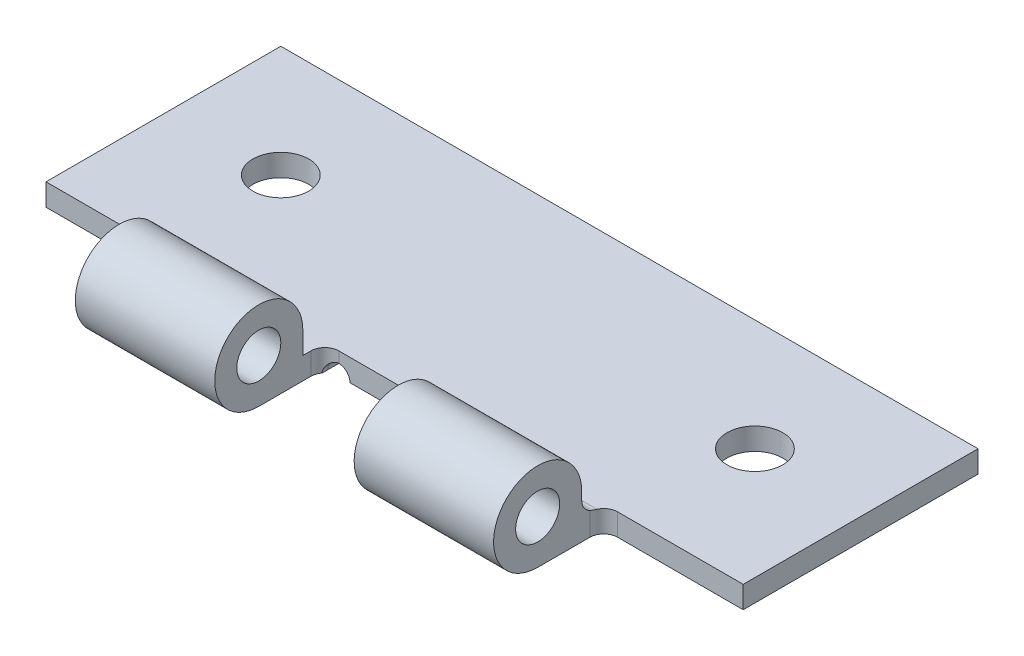
ISO-10303-21;
HEADER;
FILE_DESCRIPTION(('STEP AP214'),'2;1');
FILE_NAME('part.step','',(''),(''),'','','');
FILE_SCHEMA(('AUTOMOTIVE_DESIGN { 1 0 10303 214 1 1 1 1 }'));
ENDSEC;
DATA;
#1=APPLICATION_CONTEXT('core data for automotive mechanical design processes');
#2=APPLICATION_PROTOCOL_DEFINITION('international standard','automotive_design',2000,#1);
#3=PRODUCT_CONTEXT('',#1,'mechanical');
#4=PRODUCT('Part','Part','',(#3));
#5=PRODUCT_RELATED_PRODUCT_CATEGORY('part','',(#4));
#6=PRODUCT_DEFINITION_FORMATION('','',#4);
#7=PRODUCT_DEFINITION_CONTEXT('part definition',#1,'design');
#8=PRODUCT_DEFINITION('design','',#6,#7);
#9=PRODUCT_DEFINITION_SHAPE('','',#8);
#10=(LENGTH_UNIT() NAMED_UNIT(*) SI_UNIT(.MILLI.,.METRE.));
#11=(NAMED_UNIT(*) PLANE_ANGLE_UNIT() SI_UNIT($,.RADIAN.));
#12=(NAMED_UNIT(*) SI_UNIT($,.STERADIAN.) SOLID_ANGLE_UNIT());
#13=UNCERTAINTY_MEASURE_WITH_UNIT(LENGTH_MEASURE(1.E-05),#10,'distance_accuracy_value','');
#14=(GEOMETRIC_REPRESENTATION_CONTEXT(3) GLOBAL_UNCERTAINTY_ASSIGNED_CONTEXT((#13)) GLOBAL_UNIT_ASSIGNED_CONTEXT((#10,
#11,#12)) REPRESENTATION_CONTEXT('',''));
#15=CARTESIAN_POINT('',(0.,0.,0.));
#16=DIRECTION('',(0.,0.,1.));
#17=DIRECTION('',(1.,0.,0.));
#18=AXIS2_PLACEMENT_3D('',#15,#16,#17);
#19=CARTESIAN_POINT('',(0.,0.,0.));
#20=DIRECTION('',(0.,-1.,0.));
#21=DIRECTION('',(0.,0.,-1.));
#22=AXIS2_PLACEMENT_3D('',#19,#20,#21);
#23=PLANE('',#22);
#24=CARTESIAN_POINT('',(13.2676056338028,0.,-1.25352112676056));
#25=DIRECTION('',(0.,-1.,0.));
#26=DIRECTION('',(0.,0.,-1.));
#27=AXIS2_PLACEMENT_3D('',#24,#25,#26);
#28=CIRCLE('',#27,1.);
#29=CARTESIAN_POINT('',(13.2676056338028,0.,-2.25352112676057));
#30=VERTEX_POINT('',#29);
#31=EDGE_CURVE('E302',#30,#30,#28,.T.);
#32=ORIENTED_EDGE('',*,*,#31,.F.);
#33=EDGE_LOOP('',(#32));
#34=FACE_BOUND('',#33,.T.);
#35=DIRECTION('',(1.,0.,0.));
#36=VECTOR('',#35,1.);
#37=CARTESIAN_POINT('',(2.26760563380282,0.,3.16647887323944));
#38=LINE('',#37,#36);
#39=CARTESIAN_POINT('',(3.16760563380282,0.,3.16647887323944));
#40=VERTEX_POINT('',#39);
#41=CARTESIAN_POINT('',(6.76760563380282,0.,3.16647887323944));
#42=VERTEX_POINT('',#41);
#43=EDGE_CURVE('E231',#40,#42,#38,.T.);
#44=ORIENTED_EDGE('',*,*,#43,.F.);
#45=DIRECTION('',(0.,0.,1.));
#46=VECTOR('',#45,1.);
#47=CARTESIAN_POINT('',(3.16760563380282,0.,-6.25352112676056));
#48=LINE('',#47,#46);
#49=CARTESIAN_POINT('',(3.16760563380282,0.,-5.25352112676056));
#50=VERTEX_POINT('',#49);
#51=EDGE_CURVE('E211',#40,#50,#48,.F.);
#52=ORIENTED_EDGE('',*,*,#51,.T.);
#53=DIRECTION('',(-1.,0.,0.));
#54=VECTOR('',#53,1.);
#55=CARTESIAN_POINT('',(-7.73239436619718,0.,-5.25352112676056));
#56=LINE('',#55,#54);
#57=CARTESIAN_POINT('',(17.2676056338028,0.,-5.25352112676056));
#58=VERTEX_POINT('',#57);
#59=EDGE_CURVE('E346',#58,#50,#56,.T.);
#60=ORIENTED_EDGE('',*,*,#59,.F.);
#61=DIRECTION('',(0.,0.,-1.));
#62=VECTOR('',#61,1.);
#63=CARTESIAN_POINT('',(17.2676056338028,0.,4.74647887323944));
#64=LINE('',#63,#62);
#65=CARTESIAN_POINT('',(17.2676056338028,0.,3.16647887323944));
#66=VERTEX_POINT('',#65);
#67=EDGE_CURVE('E356',#66,#58,#64,.T.);
#68=ORIENTED_EDGE('',*,*,#67,.F.);
#69=DIRECTION('',(1.,0.,0.));
#70=VECTOR('',#69,1.);
#71=CARTESIAN_POINT('',(17.2676056338028,0.,3.16647887323944));
#72=LINE('',#71,#70);
#73=CARTESIAN_POINT('',(12.7676056338028,0.,3.16647887323944));
#74=VERTEX_POINT('',#73);
#75=EDGE_CURVE('E227',#74,#66,#72,.T.);
#76=ORIENTED_EDGE('',*,*,#75,.F.);
#77=CARTESIAN_POINT('',(12.7676056338028,0.,3.66647887323944));
#78=DIRECTION('',(0.,-1.,0.));
#79=DIRECTION('',(0.,0.,-1.));
#80=AXIS2_PLACEMENT_3D('',#77,#78,#79);
#81=CIRCLE('',#80,0.5);
#82=CARTESIAN_POINT('',(12.2676056338028,0.,3.66647887323944));
#83=VERTEX_POINT('',#82);
#84=EDGE_CURVE('E421',#74,#83,#81,.F.);
#85=ORIENTED_EDGE('',*,*,#84,.T.);
#86=DIRECTION('',(0.,0.,-1.));
#87=VECTOR('',#86,1.);
#88=CARTESIAN_POINT('',(12.2676056338028,0.,5.53647887323944));
#89=LINE('',#88,#87);
#90=CARTESIAN_POINT('',(12.2676056338028,0.,5.53647887323944));
#91=VERTEX_POINT('',#90);
#92=EDGE_CURVE('E328',#91,#83,#89,.T.);
#93=ORIENTED_EDGE('',*,*,#92,.F.);
#94=DIRECTION('',(1.,0.,0.));
#95=VECTOR('',#94,1.);
#96=CARTESIAN_POINT('',(7.26760563380282,0.,5.53647887323944));
#97=LINE('',#96,#95);
#98=CARTESIAN_POINT('',(7.26760563380282,0.,5.53647887323944));
#99=VERTEX_POINT('',#98);
#100=EDGE_CURVE('E324',#99,#91,#97,.T.);
#101=ORIENTED_EDGE('',*,*,#100,.F.);
#102=DIRECTION('',(0.,0.,-1.));
#103=VECTOR('',#102,1.);
#104=CARTESIAN_POINT('',(7.26760563380282,0.,5.53647887323944));
#105=LINE('',#104,#103);
#106=CARTESIAN_POINT('',(7.26760563380282,0.,3.66647887323944));
#107=VERTEX_POINT('',#106);
#108=EDGE_CURVE('E316',#99,#107,#105,.T.);
#109=ORIENTED_EDGE('',*,*,#108,.T.);
#110=CARTESIAN_POINT('',(6.76760563380282,0.,3.66647887323944));
#111=DIRECTION('',(0.,-1.,0.));
#112=DIRECTION('',(0.,0.,-1.));
#113=AXIS2_PLACEMENT_3D('',#110,#111,#112);
#114=CIRCLE('',#113,0.5);
#115=EDGE_CURVE('E456',#107,#42,#114,.F.);
#116=ORIENTED_EDGE('',*,*,#115,.T.);
#117=EDGE_LOOP('',(#44,#52,#60,#68,#76,#85,#93,#101,#109,#116));
#118=FACE_BOUND('',#117,.T.);
#119=ADVANCED_FACE('F39',(#34,#118),#23,.T.);
#120=CARTESIAN_POINT('',(-3.73239436619718,0.,-1.25352112676056));
#121=DIRECTION('',(0.,-1.,0.));
#122=DIRECTION('',(0.,0.,-1.));
#123=AXIS2_PLACEMENT_3D('',#120,#121,#122);
#124=CIRCLE('',#123,1.);
#125=CARTESIAN_POINT('',(-3.73239436619718,0.,-2.25352112676057));
#126=VERTEX_POINT('',#125);
#127=EDGE_CURVE('E255',#126,#126,#124,.F.);
#128=ORIENTED_EDGE('',*,*,#127,.T.);
#129=EDGE_LOOP('',(#128));
#130=FACE_BOUND('',#129,.T.);
#131=CARTESIAN_POINT('',(2.36760563380282,0.,-5.25352112676056));
#132=VERTEX_POINT('',#131);
#133=CARTESIAN_POINT('',(-7.73239436619718,0.,-5.25352112676056));
#134=VERTEX_POINT('',#133);
#135=EDGE_CURVE('E209',#132,#134,#56,.T.);
#136=ORIENTED_EDGE('',*,*,#135,.F.);
#137=DIRECTION('',(0.,0.,1.));
#138=VECTOR('',#137,1.);
#139=CARTESIAN_POINT('',(2.36760563380282,0.,-6.25352112676056));
#140=LINE('',#139,#138);
#141=CARTESIAN_POINT('',(2.36760563380282,0.,3.16647887323944));
#142=VERTEX_POINT('',#141);
#143=EDGE_CURVE('E196',#132,#142,#140,.T.);
#144=ORIENTED_EDGE('',*,*,#143,.T.);
#145=DIRECTION('',(0.,0.,1.));
#146=VECTOR('',#145,1.);
#147=CARTESIAN_POINT('',(2.36760563380282,0.,3.16647887323944));
#148=LINE('',#147,#146);
#149=CARTESIAN_POINT('',(2.36760563380282,0.,3.36647887323944));
#150=VERTEX_POINT('',#149);
#151=EDGE_CURVE('E189',#142,#150,#148,.T.);
#152=ORIENTED_EDGE('',*,*,#151,.T.);
#153=CARTESIAN_POINT('',(2.76760563380282,0.,3.66647887323944));
#154=DIRECTION('',(0.,-1.,0.));
#155=DIRECTION('',(0.,0.,-1.));
#156=AXIS2_PLACEMENT_3D('',#153,#154,#155);
#157=CIRCLE('',#156,0.5);
#158=CARTESIAN_POINT('',(2.26760563380282,0.,3.66647887323944));
#159=VERTEX_POINT('',#158);
#160=EDGE_CURVE('E461',#150,#159,#157,.F.);
#161=ORIENTED_EDGE('',*,*,#160,.T.);
#162=DIRECTION('',(0.,0.,-1.));
#163=VECTOR('',#162,1.);
#164=CARTESIAN_POINT('',(2.26760563380282,0.,5.53647887323944));
#165=LINE('',#164,#163);
#166=CARTESIAN_POINT('',(2.26760563380282,0.,5.53647887323944));
#167=VERTEX_POINT('',#166);
#168=EDGE_CURVE('E273',#167,#159,#165,.T.);
#169=ORIENTED_EDGE('',*,*,#168,.F.);
#170=DIRECTION('',(-1.,0.,0.));
#171=VECTOR('',#170,1.);
#172=CARTESIAN_POINT('',(2.26760563380282,0.,5.53647887323944));
#173=LINE('',#172,#171);
#174=CARTESIAN_POINT('',(-2.73239436619718,0.,5.53647887323944));
#175=VERTEX_POINT('',#174);
#176=EDGE_CURVE('E287',#167,#175,#173,.T.);
#177=ORIENTED_EDGE('',*,*,#176,.T.);
#178=DIRECTION('',(0.,0.,-1.));
#179=VECTOR('',#178,1.);
#180=CARTESIAN_POINT('',(-2.73239436619718,0.,5.53647887323944));
#181=LINE('',#180,#179);
#182=CARTESIAN_POINT('',(-2.73239436619718,0.,3.66647887323944));
#183=VERTEX_POINT('',#182);
#184=EDGE_CURVE('E270',#175,#183,#181,.T.);
#185=ORIENTED_EDGE('',*,*,#184,.T.);
#186=CARTESIAN_POINT('',(-3.23239436619718,0.,3.66647887323944));
#187=DIRECTION('',(0.,-1.,0.));
#188=DIRECTION('',(0.,0.,-1.));
#189=AXIS2_PLACEMENT_3D('',#186,#187,#188);
#190=CIRCLE('',#189,0.5);
#191=CARTESIAN_POINT('',(-3.23239436619718,0.,3.16647887323944));
#192=VERTEX_POINT('',#191);
#193=EDGE_CURVE('E418',#183,#192,#190,.F.);
#194=ORIENTED_EDGE('',*,*,#193,.T.);
#195=DIRECTION('',(1.,0.,0.));
#196=VECTOR('',#195,1.);
#197=CARTESIAN_POINT('',(-7.73239436619718,0.,3.16647887323944));
#198=LINE('',#197,#196);
#199=CARTESIAN_POINT('',(-7.73239436619718,0.,3.16647887323944));
#200=VERTEX_POINT('',#199);
#201=EDGE_CURVE('E243',#200,#192,#198,.T.);
#202=ORIENTED_EDGE('',*,*,#201,.F.);
#203=DIRECTION('',(0.,0.,1.));
#204=VECTOR('',#203,1.);
#205=CARTESIAN_POINT('',(-7.73239436619718,0.,4.74647887323944));
#206=LINE('',#205,#204);
#207=EDGE_CURVE('E338',#134,#200,#206,.T.);
#208=ORIENTED_EDGE('',*,*,#207,.F.);
#209=EDGE_LOOP('',(#136,#144,#152,#161,#169,#177,#185,#194,#202,#208));
#210=FACE_BOUND('',#209,.T.);
#211=ADVANCED_FACE('F207',(#130,#210),#23,.T.);
#212=CARTESIAN_POINT('',(2.76760563380282,0.,3.66647887323944));
#213=DIRECTION('',(0.,-1.,0.));
#214=DIRECTION('',(0.,0.,-1.));
#215=AXIS2_PLACEMENT_3D('',#212,#213,#214);
#216=CYLINDRICAL_SURFACE('',#215,0.5);
#217=CARTESIAN_POINT('',(2.76760563380282,0.4,3.16647887323944));
#218=CARTESIAN_POINT('',(2.74827024317243,0.400029001810531,3.16644736894802));
#219=CARTESIAN_POINT('',(2.72897779877845,0.398600271028259,3.16759857671811));
#220=CARTESIAN_POINT('',(2.69116866166657,0.393081616588121,3.17200110549289));
#221=CARTESIAN_POINT('',(2.67264718159873,0.389012033724936,3.17523637293437));
#222=CARTESIAN_POINT('',(2.63680043914977,0.378471364605712,3.18353927358835));
#223=CARTESIAN_POINT('',(2.61947251181179,0.372005848685543,3.18860265589649));
#224=CARTESIAN_POINT('',(2.58625039872911,0.356991698998091,3.2001954513365));
#225=CARTESIAN_POINT('',(2.57035891424733,0.348439247977833,3.20672754918424));
#226=CARTESIAN_POINT('',(2.53496666622787,0.326273067599014,3.22332842010777));
#227=CARTESIAN_POINT('',(2.51612758214882,0.311932940005493,3.23383781260024));
#228=CARTESIAN_POINT('',(2.48151932609226,0.280540325168059,3.25589720802994));
#229=CARTESIAN_POINT('',(2.46575854914103,0.263480644910439,3.26744993436123));
#230=CARTESIAN_POINT('',(2.43717534101159,0.226647389361927,3.29076567896971));
#231=CARTESIAN_POINT('',(2.42440299333242,0.206835368717521,3.30252914823743));
#232=CARTESIAN_POINT('',(2.40231436611412,0.16469712736713,3.32471166120384));
#233=CARTESIAN_POINT('',(2.39298728172102,0.142379058140846,3.33513484004315));
#234=CARTESIAN_POINT('',(2.38131935735902,0.104859328617966,3.34894337015235));
#235=CARTESIAN_POINT('',(2.3776816741986,0.0904853845625058,3.35346293184157));
#236=CARTESIAN_POINT('',(2.37200477573013,0.0610097709844862,3.36066466891768));
#237=CARTESIAN_POINT('',(2.36995898885431,0.0459113693890692,3.36335439228086));
#238=CARTESIAN_POINT('',(2.36799721759471,0.0204818574887698,3.36595849040532));
#239=CARTESIAN_POINT('',(2.36759751443449,0.0102468798446438,3.36650052629709));
#240=CARTESIAN_POINT('',(2.36760563380282,0.,3.36647887323944));
#241=B_SPLINE_CURVE_WITH_KNOTS('',3,(#217,#218,#219,#220,#221,#222,#223,#224,#225,#226,#227,
#228,#229,#230,#231,#232,#233,#234,#235,#236,#237,#238,#239,#240),.UNSPECIFIED.,.F.,.F.,(4,2,2,
2,2,2,2,2,2,2,2,4),(0.,0.0578512233200793,0.11526206134538,0.172540253119604,0.229924009376504,
0.307224735322282,0.384733415851265,0.463460486012968,0.541938516974931,0.588284272735176,
0.634437676581463,0.665140421962059),.UNSPECIFIED.);
#242=CARTESIAN_POINT('',(2.76760563380282,0.4,3.16647887323944));
#243=VERTEX_POINT('',#242);
#244=EDGE_CURVE('E11',#243,#150,#241,.T.);
#245=ORIENTED_EDGE('',*,*,#244,.F.);
#246=DIRECTION('',(0.,-1.,0.));
#247=VECTOR('',#246,1.);
#248=CARTESIAN_POINT('',(2.76760563380282,0.,3.16647887323944));
#249=LINE('',#248,#247);
#250=CARTESIAN_POINT('',(2.76760563380282,0.79,3.16647887323944));
#251=VERTEX_POINT('',#250);
#252=EDGE_CURVE('E401',#251,#243,#249,.T.);
#253=ORIENTED_EDGE('',*,*,#252,.F.);
#254=CARTESIAN_POINT('',(2.76760563380282,0.79,3.66647887323944));
#255=DIRECTION('',(0.,-1.,0.));
#256=DIRECTION('',(0.,0.,-1.));
#257=AXIS2_PLACEMENT_3D('',#254,#255,#256);
#258=CIRCLE('',#257,0.5);
#259=CARTESIAN_POINT('',(2.26760563380282,0.79,3.66647887323944));
#260=VERTEX_POINT('',#259);
#261=EDGE_CURVE('E54',#260,#251,#258,.T.);
#262=ORIENTED_EDGE('',*,*,#261,.F.);
#263=DIRECTION('',(0.,-1.,0.));
#264=VECTOR('',#263,1.);
#265=CARTESIAN_POINT('',(2.26760563380282,1.58,3.66647887323944));
#266=LINE('',#265,#264);
#267=EDGE_CURVE('E412',#159,#260,#266,.F.);
#268=ORIENTED_EDGE('',*,*,#267,.F.);
#269=ORIENTED_EDGE('',*,*,#160,.F.);
#270=EDGE_LOOP('',(#245,#253,#262,#268,#269));
#271=FACE_BOUND('',#270,.T.);
#272=ADVANCED_FACE('F41',(#271),#216,.F.);
#273=CARTESIAN_POINT('',(-7.73239436619718,0.79,4.74647887323944));
#274=DIRECTION('',(1.,0.,0.));
#275=DIRECTION('',(0.,0.,-1.));
#276=AXIS2_PLACEMENT_3D('',#273,#274,#275);
#277=PLANE('',#276);
#278=DIRECTION('',(0.,-1.,0.));
#279=VECTOR('',#278,1.);
#280=CARTESIAN_POINT('',(-7.73239436619718,0.79,3.16647887323944));
#281=LINE('',#280,#279);
#282=CARTESIAN_POINT('',(-7.73239436619718,0.79,3.16647887323944));
#283=VERTEX_POINT('',#282);
#284=EDGE_CURVE('E215',#283,#200,#281,.T.);
#285=ORIENTED_EDGE('',*,*,#284,.F.);
#286=DIRECTION('',(0.,0.,1.));
#287=VECTOR('',#286,1.);
#288=CARTESIAN_POINT('',(-7.73239436619718,0.79,4.74647887323944));
#289=LINE('',#288,#287);
#290=CARTESIAN_POINT('',(-7.73239436619718,0.79,-5.25352112676056));
#291=VERTEX_POINT('',#290);
#292=EDGE_CURVE('E341',#291,#283,#289,.T.);
#293=ORIENTED_EDGE('',*,*,#292,.F.);
#294=DIRECTION('',(0.,-1.,0.));
#295=VECTOR('',#294,1.);
#296=CARTESIAN_POINT('',(-7.73239436619718,0.79,-5.25352112676056));
#297=LINE('',#296,#295);
#298=EDGE_CURVE('E352',#291,#134,#297,.T.);
#299=ORIENTED_EDGE('',*,*,#298,.T.);
#300=ORIENTED_EDGE('',*,*,#207,.T.);
#301=EDGE_LOOP('',(#285,#293,#299,#300));
#302=FACE_BOUND('',#301,.T.);
#303=ADVANCED_FACE('F502',(#302),#277,.F.);
#304=CARTESIAN_POINT('',(17.2676056338028,0.79,4.74647887323944));
#305=DIRECTION('',(-1.,0.,0.));
#306=DIRECTION('',(0.,0.,1.));
#307=AXIS2_PLACEMENT_3D('',#304,#305,#306);
#308=PLANE('',#307);
#309=DIRECTION('',(0.,1.,0.));
#310=VECTOR('',#309,1.);
#311=CARTESIAN_POINT('',(17.2676056338028,0.,3.16647887323944));
#312=LINE('',#311,#310);
#313=CARTESIAN_POINT('',(17.2676056338028,0.79,3.16647887323944));
#314=VERTEX_POINT('',#313);
#315=EDGE_CURVE('E219',#66,#314,#312,.T.);
#316=ORIENTED_EDGE('',*,*,#315,.F.);
#317=ORIENTED_EDGE('',*,*,#67,.T.);
#318=DIRECTION('',(0.,-1.,0.));
#319=VECTOR('',#318,1.);
#320=CARTESIAN_POINT('',(17.2676056338028,0.79,-5.25352112676056));
#321=LINE('',#320,#319);
#322=CARTESIAN_POINT('',(17.2676056338028,0.79,-5.25352112676056));
#323=VERTEX_POINT('',#322);
#324=EDGE_CURVE('E365',#323,#58,#321,.T.);
#325=ORIENTED_EDGE('',*,*,#324,.F.);
#326=DIRECTION('',(0.,0.,-1.));
#327=VECTOR('',#326,1.);
#328=CARTESIAN_POINT('',(17.2676056338028,0.79,4.74647887323944));
#329=LINE('',#328,#327);
#330=EDGE_CURVE('E345',#314,#323,#329,.T.);
#331=ORIENTED_EDGE('',*,*,#330,.F.);
#332=EDGE_LOOP('',(#316,#317,#325,#331));
#333=FACE_BOUND('',#332,.T.);
#334=ADVANCED_FACE('F541',(#333),#308,.F.);
#335=CARTESIAN_POINT('',(0.,0.79,0.));
#336=DIRECTION('',(0.,-1.,0.));
#337=DIRECTION('',(0.,0.,-1.));
#338=AXIS2_PLACEMENT_3D('',#335,#336,#337);
#339=PLANE('',#338);
#340=DIRECTION('',(1.,0.,0.));
#341=VECTOR('',#340,1.);
#342=CARTESIAN_POINT('',(0.,0.79,3.45647887323944));
#343=LINE('',#342,#341);
#344=CARTESIAN_POINT('',(7.22136768598605,0.79,3.45647887323944));
#345=VERTEX_POINT('',#344);
#346=CARTESIAN_POINT('',(12.3138435816196,0.79,3.45647887323944));
#347=VERTEX_POINT('',#346);
#348=EDGE_CURVE('E68',#345,#347,#343,.T.);
#349=ORIENTED_EDGE('',*,*,#348,.T.);
#350=CARTESIAN_POINT('',(12.7676056338028,0.79,3.66647887323944));
#351=DIRECTION('',(0.,-1.,0.));
#352=DIRECTION('',(0.,0.,-1.));
#353=AXIS2_PLACEMENT_3D('',#350,#351,#352);
#354=CIRCLE('',#353,0.5);
#355=CARTESIAN_POINT('',(12.7676056338028,0.79,3.16647887323944));
#356=VERTEX_POINT('',#355);
#357=EDGE_CURVE('E433',#347,#356,#354,.T.);
#358=ORIENTED_EDGE('',*,*,#357,.T.);
#359=DIRECTION('',(-1.,0.,0.));
#360=VECTOR('',#359,1.);
#361=CARTESIAN_POINT('',(17.2676056338028,0.79,3.16647887323944));
#362=LINE('',#361,#360);
#363=EDGE_CURVE('E222',#314,#356,#362,.T.);
#364=ORIENTED_EDGE('',*,*,#363,.F.);
#365=ORIENTED_EDGE('',*,*,#330,.T.);
#366=DIRECTION('',(-1.,0.,0.));
#367=VECTOR('',#366,1.);
#368=CARTESIAN_POINT('',(-7.73239436619718,0.79,-5.25352112676056));
#369=LINE('',#368,#367);
#370=EDGE_CURVE('E349',#323,#291,#369,.T.);
#371=ORIENTED_EDGE('',*,*,#370,.T.);
#372=ORIENTED_EDGE('',*,*,#292,.T.);
#373=DIRECTION('',(-1.,0.,0.));
#374=VECTOR('',#373,1.);
#375=CARTESIAN_POINT('',(-7.73239436619718,0.79,3.16647887323944));
#376=LINE('',#375,#374);
#377=CARTESIAN_POINT('',(-3.23239436619718,0.79,3.16647887323944));
#378=VERTEX_POINT('',#377);
#379=EDGE_CURVE('E247',#378,#283,#376,.T.);
#380=ORIENTED_EDGE('',*,*,#379,.F.);
#381=CARTESIAN_POINT('',(-3.23239436619718,0.79,3.66647887323944));
#382=DIRECTION('',(0.,-1.,0.));
#383=DIRECTION('',(0.,0.,-1.));
#384=AXIS2_PLACEMENT_3D('',#381,#382,#383);
#385=CIRCLE('',#384,0.5);
#386=CARTESIAN_POINT('',(-2.73239436619718,0.79,3.66647887323944));
#387=VERTEX_POINT('',#386);
#388=EDGE_CURVE('E415',#378,#387,#385,.T.);
#389=ORIENTED_EDGE('',*,*,#388,.T.);
#390=DIRECTION('',(0.,0.,1.));
#391=VECTOR('',#390,1.);
#392=CARTESIAN_POINT('',(-2.73239436619718,0.79,3.16647887323944));
#393=LINE('',#392,#391);
#394=CARTESIAN_POINT('',(-2.73239436619718,0.79,3.95647887323944));
#395=VERTEX_POINT('',#394);
#396=EDGE_CURVE('E235',#387,#395,#393,.T.);
#397=ORIENTED_EDGE('',*,*,#396,.T.);
#398=DIRECTION('',(-1.,0.,0.));
#399=VECTOR('',#398,1.);
#400=CARTESIAN_POINT('',(2.26760563380282,0.79,3.95647887323944));
#401=LINE('',#400,#399);
#402=CARTESIAN_POINT('',(2.26760563380282,0.79,3.95647887323944));
#403=VERTEX_POINT('',#402);
#404=EDGE_CURVE('E292',#403,#395,#401,.T.);
#405=ORIENTED_EDGE('',*,*,#404,.F.);
#406=DIRECTION('',(0.,0.,1.));
#407=VECTOR('',#406,1.);
#408=CARTESIAN_POINT('',(2.26760563380282,0.79,3.16647887323944));
#409=LINE('',#408,#407);
#410=EDGE_CURVE('E223',#260,#403,#409,.T.);
#411=ORIENTED_EDGE('',*,*,#410,.F.);
#412=ORIENTED_EDGE('',*,*,#261,.T.);
#413=DIRECTION('',(-1.,0.,0.));
#414=VECTOR('',#413,1.);
#415=CARTESIAN_POINT('',(2.26760563380282,0.79,3.16647887323944));
#416=LINE('',#415,#414);
#417=CARTESIAN_POINT('',(6.76760563380282,0.79,3.16647887323944));
#418=VERTEX_POINT('',#417);
#419=EDGE_CURVE('E234',#418,#251,#416,.T.);
#420=ORIENTED_EDGE('',*,*,#419,.F.);
#421=CARTESIAN_POINT('',(6.76760563380282,0.79,3.66647887323944));
#422=DIRECTION('',(0.,-1.,0.));
#423=DIRECTION('',(0.,0.,-1.));
#424=AXIS2_PLACEMENT_3D('',#421,#422,#423);
#425=CIRCLE('',#424,0.5);
#426=EDGE_CURVE('E457',#418,#345,#425,.T.);
#427=ORIENTED_EDGE('',*,*,#426,.T.);
#428=EDGE_LOOP('',(#349,#358,#364,#365,#371,#372,#380,#389,#397,#405,#411,#412,#420,#427));
#429=FACE_BOUND('',#428,.T.);
#430=CARTESIAN_POINT('',(-3.73239436619718,0.79,-1.25352112676056));
#431=DIRECTION('',(0.,-1.,0.));
#432=DIRECTION('',(0.,0.,1.));
#433=AXIS2_PLACEMENT_3D('',#430,#431,#432);
#434=CIRCLE('',#433,1.);
#435=CARTESIAN_POINT('',(-3.73239436619718,0.79,-0.253521126760563));
#436=VERTEX_POINT('',#435);
#437=EDGE_CURVE('E230',#436,#436,#434,.T.);
#438=ORIENTED_EDGE('',*,*,#437,.T.);
#439=EDGE_LOOP('',(#438));
#440=FACE_BOUND('',#439,.T.);
#441=CARTESIAN_POINT('',(13.2676056338028,0.79,-1.25352112676056));
#442=DIRECTION('',(0.,1.,0.));
#443=DIRECTION('',(0.,0.,1.));
#444=AXIS2_PLACEMENT_3D('',#441,#442,#443);
#445=CIRCLE('',#444,1.);
#446=CARTESIAN_POINT('',(13.2676056338028,0.79,-0.253521126760563));
#447=VERTEX_POINT('',#446);
#448=EDGE_CURVE('E291',#447,#447,#445,.T.);
#449=ORIENTED_EDGE('',*,*,#448,.F.);
#450=EDGE_LOOP('',(#449));
#451=FACE_BOUND('',#450,.T.);
#452=ADVANCED_FACE('F468',(#429,#440,#451),#339,.F.);
#453=CARTESIAN_POINT('',(-7.73239436619718,0.79,-5.25352112676056));
#454=DIRECTION('',(0.,0.,1.));
#455=DIRECTION('',(1.,0.,0.));
#456=AXIS2_PLACEMENT_3D('',#453,#454,#455);
#457=PLANE('',#456);
#458=CARTESIAN_POINT('',(2.76760563380282,0.,-5.25352112676056));
#459=DIRECTION('',(0.,0.,1.));
#460=DIRECTION('',(1.,0.,0.));
#461=AXIS2_PLACEMENT_3D('',#458,#459,#460);
#462=CIRCLE('',#461,0.4);
#463=EDGE_CURVE('E197',#50,#132,#462,.T.);
#464=ORIENTED_EDGE('',*,*,#463,.T.);
#465=ORIENTED_EDGE('',*,*,#135,.T.);
#466=ORIENTED_EDGE('',*,*,#298,.F.);
#467=ORIENTED_EDGE('',*,*,#370,.F.);
#468=ORIENTED_EDGE('',*,*,#324,.T.);
#469=ORIENTED_EDGE('',*,*,#59,.T.);
#470=EDGE_LOOP('',(#464,#465,#466,#467,#468,#469));
#471=FACE_BOUND('',#470,.T.);
#472=ADVANCED_FACE('F504',(#471),#457,.F.);
#473=CARTESIAN_POINT('',(7.26760563380282,1.58,5.53647887323944));
#474=DIRECTION('',(1.,0.,0.));
#475=DIRECTION('',(0.,0.,-1.));
#476=AXIS2_PLACEMENT_3D('',#473,#474,#475);
#477=PLANE('',#476);
#478=CARTESIAN_POINT('',(7.26760563380282,1.58,5.53647887323944));
#479=DIRECTION('',(1.,0.,0.));
#480=DIRECTION('',(0.,0.,-1.));
#481=AXIS2_PLACEMENT_3D('',#478,#479,#480);
#482=CIRCLE('',#481,0.79);
#483=CARTESIAN_POINT('',(7.26760563380282,1.58,4.74647887323944));
#484=VERTEX_POINT('',#483);
#485=EDGE_CURVE('E303',#484,#484,#482,.T.);
#486=ORIENTED_EDGE('',*,*,#485,.T.);
#487=EDGE_LOOP('',(#486));
#488=FACE_BOUND('',#487,.T.);
#489=CARTESIAN_POINT('',(7.26760563380282,1.29,3.45647887323944));
#490=DIRECTION('',(1.,0.,0.));
#491=DIRECTION('',(0.,0.,-1.));
#492=AXIS2_PLACEMENT_3D('',#489,#490,#491);
#493=CIRCLE('',#492,0.5);
#494=CARTESIAN_POINT('',(7.26760563380282,1.29,3.95647887323944));
#495=VERTEX_POINT('',#494);
#496=CARTESIAN_POINT('',(7.26760563380282,0.836237947818463,3.66647887323944));
#497=VERTEX_POINT('',#496);
#498=EDGE_CURVE('E377',#495,#497,#493,.T.);
#499=ORIENTED_EDGE('',*,*,#498,.T.);
#500=DIRECTION('',(0.,1.,0.));
#501=VECTOR('',#500,1.);
#502=CARTESIAN_POINT('',(7.26760563380282,1.58,3.66647887323944));
#503=LINE('',#502,#501);
#504=EDGE_CURVE('E409',#497,#107,#503,.F.);
#505=ORIENTED_EDGE('',*,*,#504,.T.);
#506=ORIENTED_EDGE('',*,*,#108,.F.);
#507=CARTESIAN_POINT('',(7.26760563380282,1.58,5.53647887323944));
#508=DIRECTION('',(1.,0.,0.));
#509=DIRECTION('',(0.,0.,-1.));
#510=AXIS2_PLACEMENT_3D('',#507,#508,#509);
#511=CIRCLE('',#510,1.58);
#512=CARTESIAN_POINT('',(7.26760563380282,1.58,3.95647887323944));
#513=VERTEX_POINT('',#512);
#514=EDGE_CURVE('E312',#513,#99,#511,.T.);
#515=ORIENTED_EDGE('',*,*,#514,.F.);
#516=DIRECTION('',(0.,1.,0.));
#517=VECTOR('',#516,1.);
#518=CARTESIAN_POINT('',(7.26760563380282,1.58,3.95647887323944));
#519=LINE('',#518,#517);
#520=EDGE_CURVE('E321',#495,#513,#519,.T.);
#521=ORIENTED_EDGE('',*,*,#520,.F.);
#522=EDGE_LOOP('',(#499,#505,#506,#515,#521));
#523=FACE_BOUND('',#522,.T.);
#524=ADVANCED_FACE('F515',(#488,#523),#477,.F.);
#525=CARTESIAN_POINT('',(12.2676056338028,1.58,5.53647887323944));
#526=DIRECTION('',(1.,0.,0.));
#527=DIRECTION('',(0.,0.,-1.));
#528=AXIS2_PLACEMENT_3D('',#525,#526,#527);
#529=PLANE('',#528);
#530=CARTESIAN_POINT('',(12.2676056338028,1.58,5.53647887323944));
#531=DIRECTION('',(1.,0.,0.));
#532=DIRECTION('',(0.,0.,-1.));
#533=AXIS2_PLACEMENT_3D('',#530,#531,#532);
#534=CIRCLE('',#533,0.79);
#535=CARTESIAN_POINT('',(12.2676056338028,1.58,4.74647887323944));
#536=VERTEX_POINT('',#535);
#537=EDGE_CURVE('E308',#536,#536,#534,.T.);
#538=ORIENTED_EDGE('',*,*,#537,.F.);
#539=EDGE_LOOP('',(#538));
#540=FACE_BOUND('',#539,.T.);
#541=ORIENTED_EDGE('',*,*,#92,.T.);
#542=DIRECTION('',(0.,-1.,0.));
#543=VECTOR('',#542,1.);
#544=CARTESIAN_POINT('',(12.2676056338028,0.79,3.66647887323944));
#545=LINE('',#544,#543);
#546=CARTESIAN_POINT('',(12.2676056338028,0.836237947818463,3.66647887323944));
#547=VERTEX_POINT('',#546);
#548=EDGE_CURVE('E398',#83,#547,#545,.F.);
#549=ORIENTED_EDGE('',*,*,#548,.T.);
#550=CARTESIAN_POINT('',(12.2676056338028,1.29,3.45647887323944));
#551=DIRECTION('',(1.,0.,0.));
#552=DIRECTION('',(0.,0.,-1.));
#553=AXIS2_PLACEMENT_3D('',#550,#551,#552);
#554=CIRCLE('',#553,0.5);
#555=CARTESIAN_POINT('',(12.2676056338028,1.29,3.95647887323944));
#556=VERTEX_POINT('',#555);
#557=EDGE_CURVE('E374',#547,#556,#554,.F.);
#558=ORIENTED_EDGE('',*,*,#557,.T.);
#559=DIRECTION('',(0.,1.,0.));
#560=VECTOR('',#559,1.);
#561=CARTESIAN_POINT('',(12.2676056338028,1.58,3.95647887323944));
#562=LINE('',#561,#560);
#563=CARTESIAN_POINT('',(12.2676056338028,1.58,3.95647887323944));
#564=VERTEX_POINT('',#563);
#565=EDGE_CURVE('E317',#556,#564,#562,.T.);
#566=ORIENTED_EDGE('',*,*,#565,.T.);
#567=CARTESIAN_POINT('',(12.2676056338028,1.58,5.53647887323944));
#568=DIRECTION('',(1.,0.,0.));
#569=DIRECTION('',(0.,0.,-1.));
#570=AXIS2_PLACEMENT_3D('',#567,#568,#569);
#571=CIRCLE('',#570,1.58);
#572=EDGE_CURVE('E307',#564,#91,#571,.T.);
#573=ORIENTED_EDGE('',*,*,#572,.T.);
#574=EDGE_LOOP('',(#541,#549,#558,#566,#573));
#575=FACE_BOUND('',#574,.T.);
#576=ADVANCED_FACE('F527',(#540,#575),#529,.T.);
#577=CARTESIAN_POINT('',(7.26760563380282,1.58,5.53647887323944));
#578=DIRECTION('',(1.,0.,0.));
#579=DIRECTION('',(0.,0.,-1.));
#580=AXIS2_PLACEMENT_3D('',#577,#578,#579);
#581=CYLINDRICAL_SURFACE('',#580,1.58);
#582=ORIENTED_EDGE('',*,*,#572,.F.);
#583=DIRECTION('',(1.,0.,0.));
#584=VECTOR('',#583,1.);
#585=CARTESIAN_POINT('',(7.26760563380282,1.58,3.95647887323944));
#586=LINE('',#585,#584);
#587=EDGE_CURVE('E334',#513,#564,#586,.T.);
#588=ORIENTED_EDGE('',*,*,#587,.F.);
#589=ORIENTED_EDGE('',*,*,#514,.T.);
#590=ORIENTED_EDGE('',*,*,#100,.T.);
#591=EDGE_LOOP('',(#582,#588,#589,#590));
#592=FACE_BOUND('',#591,.T.);
#593=ADVANCED_FACE('F524',(#592),#581,.T.);
#594=CARTESIAN_POINT('',(7.26760563380282,1.58,3.95647887323944));
#595=DIRECTION('',(0.,0.,-1.));
#596=DIRECTION('',(-1.,0.,0.));
#597=AXIS2_PLACEMENT_3D('',#594,#595,#596);
#598=PLANE('',#597);
#599=ORIENTED_EDGE('',*,*,#565,.F.);
#600=DIRECTION('',(1.,0.,0.));
#601=VECTOR('',#600,1.);
#602=CARTESIAN_POINT('',(7.26760563380282,1.29,3.95647887323944));
#603=LINE('',#602,#601);
#604=EDGE_CURVE('E371',#556,#495,#603,.F.);
#605=ORIENTED_EDGE('',*,*,#604,.T.);
#606=ORIENTED_EDGE('',*,*,#520,.T.);
#607=ORIENTED_EDGE('',*,*,#587,.T.);
#608=EDGE_LOOP('',(#599,#605,#606,#607));
#609=FACE_BOUND('',#608,.T.);
#610=ADVANCED_FACE('F521',(#609),#598,.T.);
#611=CARTESIAN_POINT('',(7.26760563380282,1.58,5.53647887323944));
#612=DIRECTION('',(1.,0.,0.));
#613=DIRECTION('',(0.,0.,-1.));
#614=AXIS2_PLACEMENT_3D('',#611,#612,#613);
#615=CYLINDRICAL_SURFACE('',#614,0.79);
#616=ORIENTED_EDGE('',*,*,#485,.F.);
#617=EDGE_LOOP('',(#616));
#618=FACE_BOUND('',#617,.T.);
#619=ORIENTED_EDGE('',*,*,#537,.T.);
#620=EDGE_LOOP('',(#619));
#621=FACE_BOUND('',#620,.T.);
#622=ADVANCED_FACE('F653',(#618,#621),#615,.F.);
#623=CARTESIAN_POINT('',(0.,1.29,3.45647887323944));
#624=DIRECTION('',(1.,0.,0.));
#625=DIRECTION('',(0.,0.,-1.));
#626=AXIS2_PLACEMENT_3D('',#623,#624,#625);
#627=CYLINDRICAL_SURFACE('',#626,0.5);
#628=ORIENTED_EDGE('',*,*,#498,.F.);
#629=ORIENTED_EDGE('',*,*,#604,.F.);
#630=ORIENTED_EDGE('',*,*,#557,.F.);
#631=CARTESIAN_POINT('',(12.2676056338028,0.836237947818463,3.66647887323944));
#632=CARTESIAN_POINT('',(12.2675702493509,0.827362018398357,3.64738875897221));
#633=CARTESIAN_POINT('',(12.2686983249264,0.819750943061804,3.62769185922536));
#634=CARTESIAN_POINT('',(12.2733783458048,0.807264353716076,3.58828558182169));
#635=CARTESIAN_POINT('',(12.2768681432216,0.802324405242139,3.56858916913034));
#636=CARTESIAN_POINT('',(12.2853703922638,0.795698722063167,3.53341228410109));
#637=CARTESIAN_POINT('',(12.2899176848222,0.793550859728045,3.51790366177333));
#638=CARTESIAN_POINT('',(12.3006472040068,0.790681682933965,3.4869635103225));
#639=CARTESIAN_POINT('',(12.3068611534451,0.789990638425231,3.47154013713955));
#640=CARTESIAN_POINT('',(12.3138435816211,0.79,3.4564788732398));
#641=B_SPLINE_CURVE_WITH_KNOTS('',3,(#631,#632,#633,#634,#635,#636,#637,#638,#639,#640),
.UNSPECIFIED.,.F.,.F.,(4,2,2,2,4),(0.,0.0631113819485461,0.124623453502949,0.173393504101557,
0.223167303412079),.UNSPECIFIED.);
#642=EDGE_CURVE('E424',#547,#347,#641,.T.);
#643=ORIENTED_EDGE('',*,*,#642,.T.);
#644=ORIENTED_EDGE('',*,*,#348,.F.);
#645=CARTESIAN_POINT('',(7.22136768598605,0.79,3.45647887323944));
#646=CARTESIAN_POINT('',(7.23024361540518,0.789964615548071,3.475568987507));
#647=CARTESIAN_POINT('',(7.23785469074132,0.791092691123601,3.49526588725395));
#648=CARTESIAN_POINT('',(7.25034128008673,0.795772712002054,3.53467216465767));
#649=CARTESIAN_POINT('',(7.25528122856074,0.799262509418902,3.55436857734897));
#650=CARTESIAN_POINT('',(7.26190691173974,0.807764758461069,3.58954546237819));
#651=CARTESIAN_POINT('',(7.26405477407484,0.812312051019511,3.60505408470595));
#652=CARTESIAN_POINT('',(7.26692395086886,0.823041570204148,3.63599423615678));
#653=CARTESIAN_POINT('',(7.26761499537757,0.829255519642446,3.65141760933972));
#654=CARTESIAN_POINT('',(7.26760563380282,0.836237947818463,3.66647887323944));
#655=B_SPLINE_CURVE_WITH_KNOTS('',3,(#645,#646,#647,#648,#649,#650,#651,#652,#653,#654),
.UNSPECIFIED.,.F.,.F.,(4,2,2,2,4),(0.,0.0631113819484053,0.124623453502766,0.173393504101389,
0.223167303411871),.UNSPECIFIED.);
#656=EDGE_CURVE('E449',#345,#497,#655,.T.);
#657=ORIENTED_EDGE('',*,*,#656,.T.);
#658=EDGE_LOOP('',(#628,#629,#630,#643,#644,#657));
#659=FACE_BOUND('',#658,.T.);
#660=ADVANCED_FACE('F435',(#659),#627,.F.);
#661=CARTESIAN_POINT('',(13.2676056338028,-4.21,-1.25352112676056));
#662=DIRECTION('',(0.,1.,0.));
#663=DIRECTION('',(0.,0.,1.));
#664=AXIS2_PLACEMENT_3D('',#661,#662,#663);
#665=CYLINDRICAL_SURFACE('',#664,1.);
#666=ORIENTED_EDGE('',*,*,#31,.T.);
#667=EDGE_LOOP('',(#666));
#668=FACE_BOUND('',#667,.T.);
#669=ORIENTED_EDGE('',*,*,#448,.T.);
#670=EDGE_LOOP('',(#669));
#671=FACE_BOUND('',#670,.T.);
#672=ADVANCED_FACE('F641',(#668,#671),#665,.F.);
#673=CARTESIAN_POINT('',(2.26760563380282,1.58,5.53647887323944));
#674=DIRECTION('',(-1.,0.,0.));
#675=DIRECTION('',(0.,0.,-1.));
#676=AXIS2_PLACEMENT_3D('',#673,#674,#675);
#677=PLANE('',#676);
#678=ORIENTED_EDGE('',*,*,#168,.T.);
#679=ORIENTED_EDGE('',*,*,#267,.T.);
#680=ORIENTED_EDGE('',*,*,#410,.T.);
#681=DIRECTION('',(0.,1.,0.));
#682=VECTOR('',#681,1.);
#683=CARTESIAN_POINT('',(2.26760563380282,1.58,3.95647887323944));
#684=LINE('',#683,#682);
#685=CARTESIAN_POINT('',(2.26760563380282,1.58,3.95647887323944));
#686=VERTEX_POINT('',#685);
#687=EDGE_CURVE('E269',#403,#686,#684,.T.);
#688=ORIENTED_EDGE('',*,*,#687,.T.);
#689=CARTESIAN_POINT('',(2.26760563380282,1.58,5.53647887323944));
#690=DIRECTION('',(1.,0.,0.));
#691=DIRECTION('',(0.,0.,-1.));
#692=AXIS2_PLACEMENT_3D('',#689,#690,#691);
#693=CIRCLE('',#692,1.58);
#694=EDGE_CURVE('E265',#686,#167,#693,.T.);
#695=ORIENTED_EDGE('',*,*,#694,.T.);
#696=EDGE_LOOP('',(#678,#679,#680,#688,#695));
#697=FACE_BOUND('',#696,.T.);
#698=CARTESIAN_POINT('',(2.26760563380282,1.58,5.53647887323944));
#699=DIRECTION('',(1.,0.,0.));
#700=DIRECTION('',(0.,0.,-1.));
#701=AXIS2_PLACEMENT_3D('',#698,#699,#700);
#702=CIRCLE('',#701,0.79);
#703=CARTESIAN_POINT('',(2.26760563380282,1.58,4.74647887323944));
#704=VERTEX_POINT('',#703);
#705=EDGE_CURVE('E256',#704,#704,#702,.T.);
#706=ORIENTED_EDGE('',*,*,#705,.F.);
#707=EDGE_LOOP('',(#706));
#708=FACE_BOUND('',#707,.T.);
#709=ADVANCED_FACE('F478',(#697,#708),#677,.F.);
#710=CARTESIAN_POINT('',(-2.73239436619718,1.58,5.53647887323944));
#711=DIRECTION('',(-1.,0.,0.));
#712=DIRECTION('',(0.,0.,-1.));
#713=AXIS2_PLACEMENT_3D('',#710,#711,#712);
#714=PLANE('',#713);
#715=ORIENTED_EDGE('',*,*,#396,.F.);
#716=DIRECTION('',(0.,1.,0.));
#717=VECTOR('',#716,1.);
#718=CARTESIAN_POINT('',(-2.73239436619718,0.,3.66647887323944));
#719=LINE('',#718,#717);
#720=EDGE_CURVE('E391',#387,#183,#719,.F.);
#721=ORIENTED_EDGE('',*,*,#720,.T.);
#722=ORIENTED_EDGE('',*,*,#184,.F.);
#723=CARTESIAN_POINT('',(-2.73239436619718,1.58,5.53647887323944));
#724=DIRECTION('',(1.,0.,0.));
#725=DIRECTION('',(0.,0.,-1.));
#726=AXIS2_PLACEMENT_3D('',#723,#724,#725);
#727=CIRCLE('',#726,1.58);
#728=CARTESIAN_POINT('',(-2.73239436619718,1.58,3.95647887323944));
#729=VERTEX_POINT('',#728);
#730=EDGE_CURVE('E260',#729,#175,#727,.T.);
#731=ORIENTED_EDGE('',*,*,#730,.F.);
#732=DIRECTION('',(0.,1.,0.));
#733=VECTOR('',#732,1.);
#734=CARTESIAN_POINT('',(-2.73239436619718,1.58,3.95647887323944));
#735=LINE('',#734,#733);
#736=EDGE_CURVE('E281',#395,#729,#735,.T.);
#737=ORIENTED_EDGE('',*,*,#736,.F.);
#738=EDGE_LOOP('',(#715,#721,#722,#731,#737));
#739=FACE_BOUND('',#738,.T.);
#740=CARTESIAN_POINT('',(-2.73239436619718,1.58,5.53647887323944));
#741=DIRECTION('',(1.,0.,0.));
#742=DIRECTION('',(0.,0.,-1.));
#743=AXIS2_PLACEMENT_3D('',#740,#741,#742);
#744=CIRCLE('',#743,0.79);
#745=CARTESIAN_POINT('',(-2.73239436619718,1.58,4.74647887323944));
#746=VERTEX_POINT('',#745);
#747=EDGE_CURVE('E261',#746,#746,#744,.T.);
#748=ORIENTED_EDGE('',*,*,#747,.T.);
#749=EDGE_LOOP('',(#748));
#750=FACE_BOUND('',#749,.T.);
#751=ADVANCED_FACE('F627',(#739,#750),#714,.T.);
#752=CARTESIAN_POINT('',(2.26760563380282,1.58,5.53647887323944));
#753=DIRECTION('',(-1.,0.,0.));
#754=DIRECTION('',(0.,0.,1.));
#755=AXIS2_PLACEMENT_3D('',#752,#753,#754);
#756=CYLINDRICAL_SURFACE('',#755,1.58);
#757=ORIENTED_EDGE('',*,*,#730,.T.);
#758=ORIENTED_EDGE('',*,*,#176,.F.);
#759=ORIENTED_EDGE('',*,*,#694,.F.);
#760=DIRECTION('',(-1.,0.,0.));
#761=VECTOR('',#760,1.);
#762=CARTESIAN_POINT('',(2.26760563380282,1.58,3.95647887323944));
#763=LINE('',#762,#761);
#764=EDGE_CURVE('E277',#686,#729,#763,.T.);
#765=ORIENTED_EDGE('',*,*,#764,.T.);
#766=EDGE_LOOP('',(#757,#758,#759,#765));
#767=FACE_BOUND('',#766,.T.);
#768=ADVANCED_FACE('F485',(#767),#756,.T.);
#769=CARTESIAN_POINT('',(2.26760563380282,1.58,3.95647887323944));
#770=DIRECTION('',(0.,0.,1.));
#771=DIRECTION('',(1.,0.,0.));
#772=AXIS2_PLACEMENT_3D('',#769,#770,#771);
#773=PLANE('',#772);
#774=ORIENTED_EDGE('',*,*,#736,.T.);
#775=ORIENTED_EDGE('',*,*,#764,.F.);
#776=ORIENTED_EDGE('',*,*,#687,.F.);
#777=ORIENTED_EDGE('',*,*,#404,.T.);
#778=EDGE_LOOP('',(#774,#775,#776,#777));
#779=FACE_BOUND('',#778,.T.);
#780=ADVANCED_FACE('F688',(#779),#773,.F.);
#781=CARTESIAN_POINT('',(2.26760563380282,1.58,5.53647887323944));
#782=DIRECTION('',(-1.,0.,0.));
#783=DIRECTION('',(0.,0.,1.));
#784=AXIS2_PLACEMENT_3D('',#781,#782,#783);
#785=CYLINDRICAL_SURFACE('',#784,0.79);
#786=ORIENTED_EDGE('',*,*,#705,.T.);
#787=EDGE_LOOP('',(#786));
#788=FACE_BOUND('',#787,.T.);
#789=ORIENTED_EDGE('',*,*,#747,.F.);
#790=EDGE_LOOP('',(#789));
#791=FACE_BOUND('',#790,.T.);
#792=ADVANCED_FACE('F693',(#788,#791),#785,.F.);
#793=CARTESIAN_POINT('',(-3.73239436619718,-4.21,-1.25352112676056));
#794=DIRECTION('',(0.,1.,0.));
#795=DIRECTION('',(0.,0.,1.));
#796=AXIS2_PLACEMENT_3D('',#793,#794,#795);
#797=CYLINDRICAL_SURFACE('',#796,1.);
#798=ORIENTED_EDGE('',*,*,#127,.F.);
#799=EDGE_LOOP('',(#798));
#800=FACE_BOUND('',#799,.T.);
#801=ORIENTED_EDGE('',*,*,#437,.F.);
#802=EDGE_LOOP('',(#801));
#803=FACE_BOUND('',#802,.T.);
#804=ADVANCED_FACE('F620',(#800,#803),#797,.F.);
#805=CARTESIAN_POINT('',(0.,0.,3.16647887323944));
#806=DIRECTION('',(0.,0.,1.));
#807=DIRECTION('',(1.,0.,0.));
#808=AXIS2_PLACEMENT_3D('',#805,#806,#807);
#809=PLANE('',#808);
#810=ORIENTED_EDGE('',*,*,#201,.T.);
#811=DIRECTION('',(0.,1.,0.));
#812=VECTOR('',#811,1.);
#813=CARTESIAN_POINT('',(-3.23239436619718,0.79,3.16647887323944));
#814=LINE('',#813,#812);
#815=EDGE_CURVE('E381',#192,#378,#814,.T.);
#816=ORIENTED_EDGE('',*,*,#815,.T.);
#817=ORIENTED_EDGE('',*,*,#379,.T.);
#818=ORIENTED_EDGE('',*,*,#284,.T.);
#819=EDGE_LOOP('',(#810,#816,#817,#818));
#820=FACE_BOUND('',#819,.T.);
#821=ADVANCED_FACE('F495',(#820),#809,.T.);
#822=CARTESIAN_POINT('',(0.,0.,3.16647887323944));
#823=DIRECTION('',(0.,0.,1.));
#824=DIRECTION('',(1.,0.,0.));
#825=AXIS2_PLACEMENT_3D('',#822,#823,#824);
#826=PLANE('',#825);
#827=ORIENTED_EDGE('',*,*,#252,.T.);
#828=CARTESIAN_POINT('',(2.76760563380282,0.,3.16647887323944));
#829=DIRECTION('',(0.,0.,-1.));
#830=DIRECTION('',(-1.,0.,0.));
#831=AXIS2_PLACEMENT_3D('',#828,#829,#830);
#832=CIRCLE('',#831,0.4);
#833=EDGE_CURVE('E203',#243,#40,#832,.T.);
#834=ORIENTED_EDGE('',*,*,#833,.T.);
#835=ORIENTED_EDGE('',*,*,#43,.T.);
#836=DIRECTION('',(0.,1.,0.));
#837=VECTOR('',#836,1.);
#838=CARTESIAN_POINT('',(6.76760563380282,0.,3.16647887323944));
#839=LINE('',#838,#837);
#840=EDGE_CURVE('E405',#42,#418,#839,.T.);
#841=ORIENTED_EDGE('',*,*,#840,.T.);
#842=ORIENTED_EDGE('',*,*,#419,.T.);
#843=EDGE_LOOP('',(#827,#834,#835,#841,#842));
#844=FACE_BOUND('',#843,.T.);
#845=ADVANCED_FACE('F475',(#844),#826,.T.);
#846=CARTESIAN_POINT('',(0.,0.,3.16647887323944));
#847=DIRECTION('',(0.,0.,1.));
#848=DIRECTION('',(1.,0.,0.));
#849=AXIS2_PLACEMENT_3D('',#846,#847,#848);
#850=PLANE('',#849);
#851=ORIENTED_EDGE('',*,*,#363,.T.);
#852=DIRECTION('',(0.,-1.,0.));
#853=VECTOR('',#852,1.);
#854=CARTESIAN_POINT('',(12.7676056338028,0.,3.16647887323944));
#855=LINE('',#854,#853);
#856=EDGE_CURVE('E394',#356,#74,#855,.T.);
#857=ORIENTED_EDGE('',*,*,#856,.T.);
#858=ORIENTED_EDGE('',*,*,#75,.T.);
#859=ORIENTED_EDGE('',*,*,#315,.T.);
#860=EDGE_LOOP('',(#851,#857,#858,#859));
#861=FACE_BOUND('',#860,.T.);
#862=ADVANCED_FACE('F536',(#861),#850,.T.);
#863=CARTESIAN_POINT('',(-3.23239436619718,0.,3.66647887323944));
#864=DIRECTION('',(0.,-1.,0.));
#865=DIRECTION('',(0.,0.,-1.));
#866=AXIS2_PLACEMENT_3D('',#863,#864,#865);
#867=CYLINDRICAL_SURFACE('',#866,0.5);
#868=ORIENTED_EDGE('',*,*,#193,.F.);
#869=ORIENTED_EDGE('',*,*,#720,.F.);
#870=ORIENTED_EDGE('',*,*,#388,.F.);
#871=ORIENTED_EDGE('',*,*,#815,.F.);
#872=EDGE_LOOP('',(#868,#869,#870,#871));
#873=FACE_BOUND('',#872,.T.);
#874=ADVANCED_FACE('F443',(#873),#867,.F.);
#875=CARTESIAN_POINT('',(12.7676056338028,0.,3.66647887323944));
#876=DIRECTION('',(0.,1.,0.));
#877=DIRECTION('',(0.,0.,1.));
#878=AXIS2_PLACEMENT_3D('',#875,#876,#877);
#879=CYLINDRICAL_SURFACE('',#878,0.5);
#880=ORIENTED_EDGE('',*,*,#642,.F.);
#881=ORIENTED_EDGE('',*,*,#548,.F.);
#882=ORIENTED_EDGE('',*,*,#84,.F.);
#883=ORIENTED_EDGE('',*,*,#856,.F.);
#884=ORIENTED_EDGE('',*,*,#357,.F.);
#885=EDGE_LOOP('',(#880,#881,#882,#883,#884));
#886=FACE_BOUND('',#885,.T.);
#887=ADVANCED_FACE('F439',(#886),#879,.F.);
#888=CARTESIAN_POINT('',(6.76760563380282,0.,3.66647887323944));
#889=DIRECTION('',(0.,1.,0.));
#890=DIRECTION('',(0.,0.,1.));
#891=AXIS2_PLACEMENT_3D('',#888,#889,#890);
#892=CYLINDRICAL_SURFACE('',#891,0.5);
#893=ORIENTED_EDGE('',*,*,#115,.F.);
#894=ORIENTED_EDGE('',*,*,#504,.F.);
#895=ORIENTED_EDGE('',*,*,#656,.F.);
#896=ORIENTED_EDGE('',*,*,#426,.F.);
#897=ORIENTED_EDGE('',*,*,#840,.F.);
#898=EDGE_LOOP('',(#893,#894,#895,#896,#897));
#899=FACE_BOUND('',#898,.T.);
#900=ADVANCED_FACE('F442',(#899),#892,.F.);
#901=CARTESIAN_POINT('',(2.76760563380282,0.,-6.25352112676056));
#902=DIRECTION('',(0.,0.,1.));
#903=DIRECTION('',(1.,0.,0.));
#904=AXIS2_PLACEMENT_3D('',#901,#902,#903);
#905=CYLINDRICAL_SURFACE('',#904,0.4);
#906=ORIENTED_EDGE('',*,*,#833,.F.);
#907=EDGE_CURVE('E60',#142,#243,#832,.T.);
#908=ORIENTED_EDGE('',*,*,#907,.F.);
#909=ORIENTED_EDGE('',*,*,#143,.F.);
#910=ORIENTED_EDGE('',*,*,#463,.F.);
#911=ORIENTED_EDGE('',*,*,#51,.F.);
#912=EDGE_LOOP('',(#906,#908,#909,#910,#911));
#913=FACE_BOUND('',#912,.T.);
#914=ADVANCED_FACE('F200',(#913),#905,.F.);
#915=CARTESIAN_POINT('',(2.76760563380282,0.,3.16647887323944));
#916=DIRECTION('',(0.,0.,1.));
#917=DIRECTION('',(1.,0.,0.));
#918=AXIS2_PLACEMENT_3D('',#915,#916,#917);
#919=CYLINDRICAL_SURFACE('',#918,0.4);
#920=ORIENTED_EDGE('',*,*,#907,.T.);
#921=ORIENTED_EDGE('',*,*,#244,.T.);
#922=ORIENTED_EDGE('',*,*,#151,.F.);
#923=EDGE_LOOP('',(#920,#921,#922));
#924=FACE_BOUND('',#923,.T.);
#925=ADVANCED_FACE('F190',(#924),#919,.F.);
#926=CLOSED_SHELL('',(#119,#211,#272,#303,#334,#452,#472,#524,#576,#593,#610,#622,#660,#672,
#709,#751,#768,#780,#792,#804,#821,#845,#862,#874,#887,#900,#914,#925));
#927=MANIFOLD_SOLID_BREP('B2',#926);
#928=ADVANCED_BREP_SHAPE_REPRESENTATION('',(#18,#927),#14);
#929=SHAPE_DEFINITION_REPRESENTATION(#9,#928);
ENDSEC;
END-ISO-10303-21;
